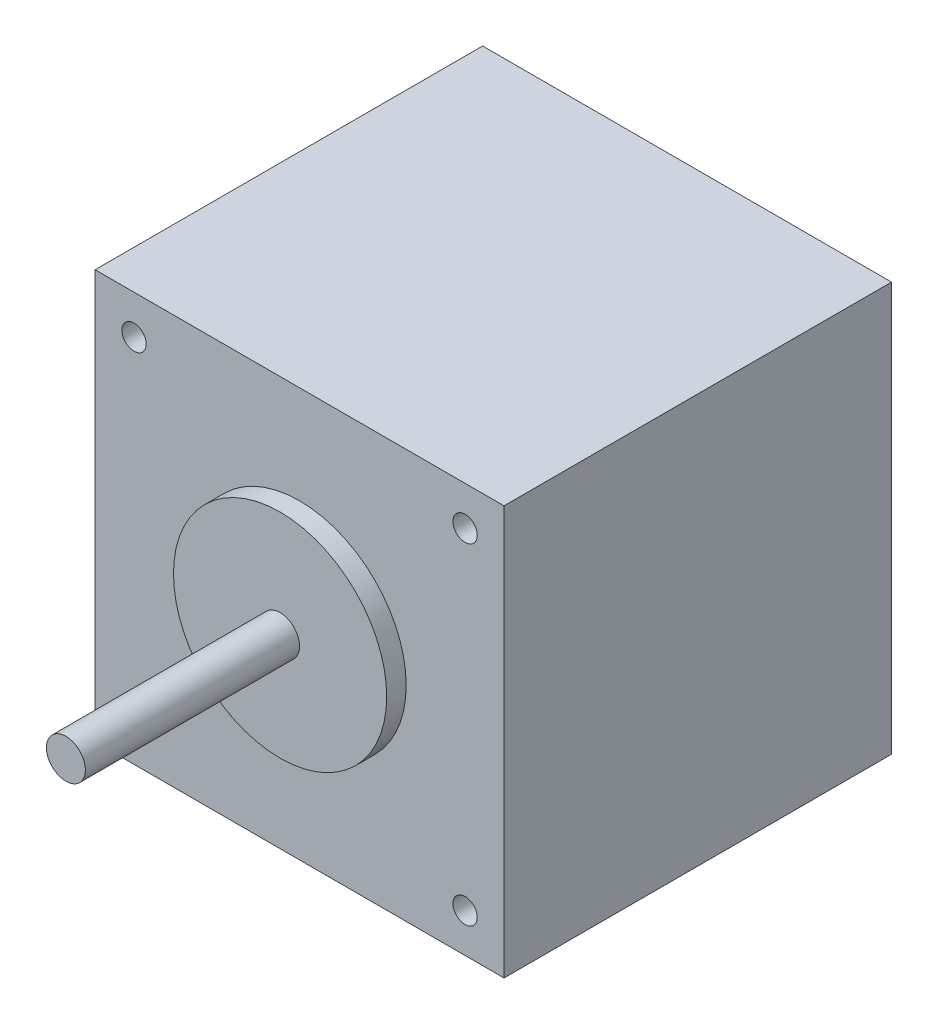
ISO-10303-21;
HEADER;
FILE_DESCRIPTION(('STEP AP214'),'2;1');
FILE_NAME('part.step','',(''),(''),'','','');
FILE_SCHEMA(('AUTOMOTIVE_DESIGN { 1 0 10303 214 1 1 1 1 }'));
ENDSEC;
DATA;
#1=APPLICATION_CONTEXT('core data for automotive mechanical design processes');
#2=APPLICATION_PROTOCOL_DEFINITION('international standard','automotive_design',2000,#1);
#3=PRODUCT_CONTEXT('',#1,'mechanical');
#4=PRODUCT('Part','Part','',(#3));
#5=PRODUCT_RELATED_PRODUCT_CATEGORY('part','',(#4));
#6=PRODUCT_DEFINITION_FORMATION('','',#4);
#7=PRODUCT_DEFINITION_CONTEXT('part definition',#1,'design');
#8=PRODUCT_DEFINITION('design','',#6,#7);
#9=PRODUCT_DEFINITION_SHAPE('','',#8);
#10=(LENGTH_UNIT() NAMED_UNIT(*) SI_UNIT(.MILLI.,.METRE.));
#11=(NAMED_UNIT(*) PLANE_ANGLE_UNIT() SI_UNIT($,.RADIAN.));
#12=(NAMED_UNIT(*) SI_UNIT($,.STERADIAN.) SOLID_ANGLE_UNIT());
#13=UNCERTAINTY_MEASURE_WITH_UNIT(LENGTH_MEASURE(1.E-05),#10,'distance_accuracy_value','');
#14=(GEOMETRIC_REPRESENTATION_CONTEXT(3) GLOBAL_UNCERTAINTY_ASSIGNED_CONTEXT((#13)) GLOBAL_UNIT_ASSIGNED_CONTEXT((#10,
#11,#12)) REPRESENTATION_CONTEXT('',''));
#15=CARTESIAN_POINT('',(0.,0.,0.));
#16=DIRECTION('',(0.,0.,1.));
#17=DIRECTION('',(1.,0.,0.));
#18=AXIS2_PLACEMENT_3D('',#15,#16,#17);
#19=CARTESIAN_POINT('',(21.,-21.,39.8));
#20=DIRECTION('',(-1.,0.,0.));
#21=DIRECTION('',(0.,0.,1.));
#22=AXIS2_PLACEMENT_3D('',#19,#20,#21);
#23=PLANE('',#22);
#24=DIRECTION('',(0.,1.,0.));
#25=VECTOR('',#24,1.);
#26=CARTESIAN_POINT('',(21.,-21.,0.));
#27=LINE('',#26,#25);
#28=CARTESIAN_POINT('',(21.,-21.,0.));
#29=VERTEX_POINT('',#28);
#30=CARTESIAN_POINT('',(21.,21.,0.));
#31=VERTEX_POINT('',#30);
#32=EDGE_CURVE('E103',#29,#31,#27,.T.);
#33=ORIENTED_EDGE('',*,*,#32,.T.);
#34=DIRECTION('',(0.,0.,-1.));
#35=VECTOR('',#34,1.);
#36=CARTESIAN_POINT('',(21.,21.,39.8));
#37=LINE('',#36,#35);
#38=CARTESIAN_POINT('',(21.,21.,39.8));
#39=VERTEX_POINT('',#38);
#40=EDGE_CURVE('E39',#39,#31,#37,.T.);
#41=ORIENTED_EDGE('',*,*,#40,.F.);
#42=DIRECTION('',(0.,1.,0.));
#43=VECTOR('',#42,1.);
#44=CARTESIAN_POINT('',(21.,-21.,39.8));
#45=LINE('',#44,#43);
#46=CARTESIAN_POINT('',(21.,-21.,39.8));
#47=VERTEX_POINT('',#46);
#48=EDGE_CURVE('E90',#47,#39,#45,.T.);
#49=ORIENTED_EDGE('',*,*,#48,.F.);
#50=DIRECTION('',(0.,0.,-1.));
#51=VECTOR('',#50,1.);
#52=CARTESIAN_POINT('',(21.,-21.,39.8));
#53=LINE('',#52,#51);
#54=EDGE_CURVE('E99',#47,#29,#53,.T.);
#55=ORIENTED_EDGE('',*,*,#54,.T.);
#56=EDGE_LOOP('',(#33,#41,#49,#55));
#57=FACE_BOUND('',#56,.T.);
#58=ADVANCED_FACE('F36',(#57),#23,.F.);
#59=CARTESIAN_POINT('',(-21.,21.,39.8));
#60=DIRECTION('',(0.,-1.,0.));
#61=DIRECTION('',(0.,0.,-1.));
#62=AXIS2_PLACEMENT_3D('',#59,#60,#61);
#63=PLANE('',#62);
#64=DIRECTION('',(-1.,0.,0.));
#65=VECTOR('',#64,1.);
#66=CARTESIAN_POINT('',(-21.,21.,0.));
#67=LINE('',#66,#65);
#68=CARTESIAN_POINT('',(-21.,21.,0.));
#69=VERTEX_POINT('',#68);
#70=EDGE_CURVE('E95',#31,#69,#67,.T.);
#71=ORIENTED_EDGE('',*,*,#70,.T.);
#72=DIRECTION('',(0.,0.,-1.));
#73=VECTOR('',#72,1.);
#74=CARTESIAN_POINT('',(-21.,21.,39.8));
#75=LINE('',#74,#73);
#76=CARTESIAN_POINT('',(-21.,21.,39.8));
#77=VERTEX_POINT('',#76);
#78=EDGE_CURVE('E93',#77,#69,#75,.T.);
#79=ORIENTED_EDGE('',*,*,#78,.F.);
#80=DIRECTION('',(-1.,0.,0.));
#81=VECTOR('',#80,1.);
#82=CARTESIAN_POINT('',(-21.,21.,39.8));
#83=LINE('',#82,#81);
#84=EDGE_CURVE('E85',#39,#77,#83,.T.);
#85=ORIENTED_EDGE('',*,*,#84,.F.);
#86=ORIENTED_EDGE('',*,*,#40,.T.);
#87=EDGE_LOOP('',(#71,#79,#85,#86));
#88=FACE_BOUND('',#87,.T.);
#89=ADVANCED_FACE('F94',(#88),#63,.F.);
#90=CARTESIAN_POINT('',(-21.,-21.,39.8));
#91=DIRECTION('',(1.,0.,0.));
#92=DIRECTION('',(0.,0.,-1.));
#93=AXIS2_PLACEMENT_3D('',#90,#91,#92);
#94=PLANE('',#93);
#95=DIRECTION('',(0.,-1.,0.));
#96=VECTOR('',#95,1.);
#97=CARTESIAN_POINT('',(-21.,-21.,0.));
#98=LINE('',#97,#96);
#99=CARTESIAN_POINT('',(-21.,-21.,0.));
#100=VERTEX_POINT('',#99);
#101=EDGE_CURVE('E71',#69,#100,#98,.T.);
#102=ORIENTED_EDGE('',*,*,#101,.T.);
#103=DIRECTION('',(0.,0.,-1.));
#104=VECTOR('',#103,1.);
#105=CARTESIAN_POINT('',(-21.,-21.,39.8));
#106=LINE('',#105,#104);
#107=CARTESIAN_POINT('',(-21.,-21.,39.8));
#108=VERTEX_POINT('',#107);
#109=EDGE_CURVE('E96',#108,#100,#106,.T.);
#110=ORIENTED_EDGE('',*,*,#109,.F.);
#111=DIRECTION('',(0.,-1.,0.));
#112=VECTOR('',#111,1.);
#113=CARTESIAN_POINT('',(-21.,-21.,39.8));
#114=LINE('',#113,#112);
#115=EDGE_CURVE('E88',#77,#108,#114,.T.);
#116=ORIENTED_EDGE('',*,*,#115,.F.);
#117=ORIENTED_EDGE('',*,*,#78,.T.);
#118=EDGE_LOOP('',(#102,#110,#116,#117));
#119=FACE_BOUND('',#118,.T.);
#120=ADVANCED_FACE('F97',(#119),#94,.F.);
#121=CARTESIAN_POINT('',(-21.,-21.,39.8));
#122=DIRECTION('',(0.,1.,0.));
#123=DIRECTION('',(0.,0.,1.));
#124=AXIS2_PLACEMENT_3D('',#121,#122,#123);
#125=PLANE('',#124);
#126=DIRECTION('',(1.,0.,0.));
#127=VECTOR('',#126,1.);
#128=CARTESIAN_POINT('',(-21.,-21.,0.));
#129=LINE('',#128,#127);
#130=EDGE_CURVE('E77',#100,#29,#129,.T.);
#131=ORIENTED_EDGE('',*,*,#130,.T.);
#132=ORIENTED_EDGE('',*,*,#54,.F.);
#133=DIRECTION('',(1.,0.,0.));
#134=VECTOR('',#133,1.);
#135=CARTESIAN_POINT('',(-21.,-21.,39.8));
#136=LINE('',#135,#134);
#137=EDGE_CURVE('E54',#108,#47,#136,.T.);
#138=ORIENTED_EDGE('',*,*,#137,.F.);
#139=ORIENTED_EDGE('',*,*,#109,.T.);
#140=EDGE_LOOP('',(#131,#132,#138,#139));
#141=FACE_BOUND('',#140,.T.);
#142=ADVANCED_FACE('F111',(#141),#125,.F.);
#143=CARTESIAN_POINT('',(0.,0.,39.8));
#144=DIRECTION('',(0.,0.,-1.));
#145=DIRECTION('',(-1.,0.,0.));
#146=AXIS2_PLACEMENT_3D('',#143,#144,#145);
#147=PLANE('',#146);
#148=CARTESIAN_POINT('',(-17.,-17.,39.8));
#149=DIRECTION('',(0.,0.,1.));
#150=DIRECTION('',(1.,0.,0.));
#151=AXIS2_PLACEMENT_3D('',#148,#149,#150);
#152=CIRCLE('',#151,1.25);
#153=CARTESIAN_POINT('',(-15.75,-17.,39.8));
#154=VERTEX_POINT('',#153);
#155=EDGE_CURVE('E128',#154,#154,#152,.T.);
#156=ORIENTED_EDGE('',*,*,#155,.F.);
#157=EDGE_LOOP('',(#156));
#158=FACE_BOUND('',#157,.T.);
#159=CARTESIAN_POINT('',(17.,-17.,39.8));
#160=DIRECTION('',(0.,0.,1.));
#161=DIRECTION('',(1.,0.,0.));
#162=AXIS2_PLACEMENT_3D('',#159,#160,#161);
#163=CIRCLE('',#162,1.25);
#164=CARTESIAN_POINT('',(18.25,-17.,39.8));
#165=VERTEX_POINT('',#164);
#166=EDGE_CURVE('E135',#165,#165,#163,.T.);
#167=ORIENTED_EDGE('',*,*,#166,.F.);
#168=EDGE_LOOP('',(#167));
#169=FACE_BOUND('',#168,.T.);
#170=CARTESIAN_POINT('',(17.,17.,39.8));
#171=DIRECTION('',(0.,0.,1.));
#172=DIRECTION('',(1.,0.,0.));
#173=AXIS2_PLACEMENT_3D('',#170,#171,#172);
#174=CIRCLE('',#173,1.25);
#175=CARTESIAN_POINT('',(18.25,17.,39.8));
#176=VERTEX_POINT('',#175);
#177=EDGE_CURVE('E141',#176,#176,#174,.T.);
#178=ORIENTED_EDGE('',*,*,#177,.F.);
#179=EDGE_LOOP('',(#178));
#180=FACE_BOUND('',#179,.T.);
#181=CARTESIAN_POINT('',(-17.,17.,39.8));
#182=DIRECTION('',(0.,0.,1.));
#183=DIRECTION('',(1.,0.,0.));
#184=AXIS2_PLACEMENT_3D('',#181,#182,#183);
#185=CIRCLE('',#184,1.25);
#186=CARTESIAN_POINT('',(-15.75,17.,39.8));
#187=VERTEX_POINT('',#186);
#188=EDGE_CURVE('E122',#187,#187,#185,.T.);
#189=ORIENTED_EDGE('',*,*,#188,.F.);
#190=EDGE_LOOP('',(#189));
#191=FACE_BOUND('',#190,.T.);
#192=CARTESIAN_POINT('',(0.,0.,39.8));
#193=DIRECTION('',(0.,0.,1.));
#194=DIRECTION('',(1.,0.,0.));
#195=AXIS2_PLACEMENT_3D('',#192,#193,#194);
#196=CIRCLE('',#195,10.95);
#197=CARTESIAN_POINT('',(10.95,0.,39.8));
#198=VERTEX_POINT('',#197);
#199=EDGE_CURVE('E45',#198,#198,#196,.T.);
#200=ORIENTED_EDGE('',*,*,#199,.F.);
#201=EDGE_LOOP('',(#200));
#202=FACE_BOUND('',#201,.T.);
#203=ORIENTED_EDGE('',*,*,#48,.T.);
#204=ORIENTED_EDGE('',*,*,#84,.T.);
#205=ORIENTED_EDGE('',*,*,#115,.T.);
#206=ORIENTED_EDGE('',*,*,#137,.T.);
#207=EDGE_LOOP('',(#203,#204,#205,#206));
#208=FACE_BOUND('',#207,.T.);
#209=ADVANCED_FACE('F86',(#158,#169,#180,#191,#202,#208),#147,.F.);
#210=CARTESIAN_POINT('',(0.,0.,0.));
#211=DIRECTION('',(0.,0.,-1.));
#212=DIRECTION('',(-1.,0.,0.));
#213=AXIS2_PLACEMENT_3D('',#210,#211,#212);
#214=PLANE('',#213);
#215=ORIENTED_EDGE('',*,*,#32,.F.);
#216=ORIENTED_EDGE('',*,*,#130,.F.);
#217=ORIENTED_EDGE('',*,*,#101,.F.);
#218=ORIENTED_EDGE('',*,*,#70,.F.);
#219=EDGE_LOOP('',(#215,#216,#217,#218));
#220=FACE_BOUND('',#219,.T.);
#221=ADVANCED_FACE('F114',(#220),#214,.T.);
#222=CARTESIAN_POINT('',(0.,0.,41.8));
#223=DIRECTION('',(0.,0.,-1.));
#224=DIRECTION('',(-1.,0.,0.));
#225=AXIS2_PLACEMENT_3D('',#222,#223,#224);
#226=CYLINDRICAL_SURFACE('',#225,10.95);
#227=CARTESIAN_POINT('',(0.,0.,41.8));
#228=DIRECTION('',(0.,0.,1.));
#229=DIRECTION('',(1.,0.,0.));
#230=AXIS2_PLACEMENT_3D('',#227,#228,#229);
#231=CIRCLE('',#230,10.95);
#232=CARTESIAN_POINT('',(10.95,0.,41.8));
#233=VERTEX_POINT('',#232);
#234=EDGE_CURVE('E106',#233,#233,#231,.T.);
#235=ORIENTED_EDGE('',*,*,#234,.F.);
#236=EDGE_LOOP('',(#235));
#237=FACE_BOUND('',#236,.T.);
#238=ORIENTED_EDGE('',*,*,#199,.T.);
#239=EDGE_LOOP('',(#238));
#240=FACE_BOUND('',#239,.T.);
#241=ADVANCED_FACE('F162',(#237,#240),#226,.T.);
#242=CARTESIAN_POINT('',(0.,0.,41.8));
#243=DIRECTION('',(0.,0.,1.));
#244=DIRECTION('',(1.,0.,0.));
#245=AXIS2_PLACEMENT_3D('',#242,#243,#244);
#246=PLANE('',#245);
#247=CARTESIAN_POINT('',(0.,0.,41.8));
#248=DIRECTION('',(0.,0.,1.));
#249=DIRECTION('',(1.,0.,0.));
#250=AXIS2_PLACEMENT_3D('',#247,#248,#249);
#251=CIRCLE('',#250,2.);
#252=CARTESIAN_POINT('',(2.,0.,41.8));
#253=VERTEX_POINT('',#252);
#254=EDGE_CURVE('E11',#253,#253,#251,.T.);
#255=ORIENTED_EDGE('',*,*,#254,.F.);
#256=EDGE_LOOP('',(#255));
#257=FACE_BOUND('',#256,.T.);
#258=ORIENTED_EDGE('',*,*,#234,.T.);
#259=EDGE_LOOP('',(#258));
#260=FACE_BOUND('',#259,.T.);
#261=ADVANCED_FACE('F158',(#257,#260),#246,.T.);
#262=CARTESIAN_POINT('',(-17.,17.,29.8));
#263=DIRECTION('',(0.,0.,1.));
#264=DIRECTION('',(1.,0.,0.));
#265=AXIS2_PLACEMENT_3D('',#262,#263,#264);
#266=CYLINDRICAL_SURFACE('',#265,1.25);
#267=CARTESIAN_POINT('',(-17.,17.,29.8));
#268=DIRECTION('',(0.,0.,1.));
#269=DIRECTION('',(1.,0.,0.));
#270=AXIS2_PLACEMENT_3D('',#267,#268,#269);
#271=CIRCLE('',#270,1.25);
#272=CARTESIAN_POINT('',(-15.75,17.,29.8));
#273=VERTEX_POINT('',#272);
#274=EDGE_CURVE('E121',#273,#273,#271,.T.);
#275=ORIENTED_EDGE('',*,*,#274,.F.);
#276=EDGE_LOOP('',(#275));
#277=FACE_BOUND('',#276,.T.);
#278=ORIENTED_EDGE('',*,*,#188,.T.);
#279=EDGE_LOOP('',(#278));
#280=FACE_BOUND('',#279,.T.);
#281=ADVANCED_FACE('F161',(#277,#280),#266,.F.);
#282=CARTESIAN_POINT('',(-17.,17.,29.8));
#283=DIRECTION('',(0.,0.,1.));
#284=DIRECTION('',(1.,0.,0.));
#285=AXIS2_PLACEMENT_3D('',#282,#283,#284);
#286=PLANE('',#285);
#287=ORIENTED_EDGE('',*,*,#274,.T.);
#288=EDGE_LOOP('',(#287));
#289=FACE_BOUND('',#288,.T.);
#290=ADVANCED_FACE('F222',(#289),#286,.T.);
#291=CARTESIAN_POINT('',(17.,17.,29.8));
#292=DIRECTION('',(0.,0.,1.));
#293=DIRECTION('',(1.,0.,0.));
#294=AXIS2_PLACEMENT_3D('',#291,#292,#293);
#295=CYLINDRICAL_SURFACE('',#294,1.25);
#296=CARTESIAN_POINT('',(17.,17.,29.8));
#297=DIRECTION('',(0.,0.,1.));
#298=DIRECTION('',(1.,0.,0.));
#299=AXIS2_PLACEMENT_3D('',#296,#297,#298);
#300=CIRCLE('',#299,1.25);
#301=CARTESIAN_POINT('',(18.25,17.,29.8));
#302=VERTEX_POINT('',#301);
#303=EDGE_CURVE('E125',#302,#302,#300,.T.);
#304=ORIENTED_EDGE('',*,*,#303,.F.);
#305=EDGE_LOOP('',(#304));
#306=FACE_BOUND('',#305,.T.);
#307=ORIENTED_EDGE('',*,*,#177,.T.);
#308=EDGE_LOOP('',(#307));
#309=FACE_BOUND('',#308,.T.);
#310=ADVANCED_FACE('F232',(#306,#309),#295,.F.);
#311=CARTESIAN_POINT('',(17.,17.,29.8));
#312=DIRECTION('',(0.,0.,1.));
#313=DIRECTION('',(1.,0.,0.));
#314=AXIS2_PLACEMENT_3D('',#311,#312,#313);
#315=PLANE('',#314);
#316=ORIENTED_EDGE('',*,*,#303,.T.);
#317=EDGE_LOOP('',(#316));
#318=FACE_BOUND('',#317,.T.);
#319=ADVANCED_FACE('F242',(#318),#315,.T.);
#320=CARTESIAN_POINT('',(17.,-17.,29.8));
#321=DIRECTION('',(0.,0.,1.));
#322=DIRECTION('',(1.,0.,0.));
#323=AXIS2_PLACEMENT_3D('',#320,#321,#322);
#324=CYLINDRICAL_SURFACE('',#323,1.25);
#325=CARTESIAN_POINT('',(17.,-17.,29.8));
#326=DIRECTION('',(0.,0.,1.));
#327=DIRECTION('',(1.,0.,0.));
#328=AXIS2_PLACEMENT_3D('',#325,#326,#327);
#329=CIRCLE('',#328,1.25);
#330=CARTESIAN_POINT('',(18.25,-17.,29.8));
#331=VERTEX_POINT('',#330);
#332=EDGE_CURVE('E138',#331,#331,#329,.T.);
#333=ORIENTED_EDGE('',*,*,#332,.F.);
#334=EDGE_LOOP('',(#333));
#335=FACE_BOUND('',#334,.T.);
#336=ORIENTED_EDGE('',*,*,#166,.T.);
#337=EDGE_LOOP('',(#336));
#338=FACE_BOUND('',#337,.T.);
#339=ADVANCED_FACE('F252',(#335,#338),#324,.F.);
#340=CARTESIAN_POINT('',(17.,-17.,29.8));
#341=DIRECTION('',(0.,0.,1.));
#342=DIRECTION('',(1.,0.,0.));
#343=AXIS2_PLACEMENT_3D('',#340,#341,#342);
#344=PLANE('',#343);
#345=ORIENTED_EDGE('',*,*,#332,.T.);
#346=EDGE_LOOP('',(#345));
#347=FACE_BOUND('',#346,.T.);
#348=ADVANCED_FACE('F262',(#347),#344,.T.);
#349=CARTESIAN_POINT('',(-17.,-17.,29.8));
#350=DIRECTION('',(0.,0.,1.));
#351=DIRECTION('',(1.,0.,0.));
#352=AXIS2_PLACEMENT_3D('',#349,#350,#351);
#353=CYLINDRICAL_SURFACE('',#352,1.25);
#354=CARTESIAN_POINT('',(-17.,-17.,29.8));
#355=DIRECTION('',(0.,0.,1.));
#356=DIRECTION('',(1.,0.,0.));
#357=AXIS2_PLACEMENT_3D('',#354,#355,#356);
#358=CIRCLE('',#357,1.25);
#359=CARTESIAN_POINT('',(-15.75,-17.,29.8));
#360=VERTEX_POINT('',#359);
#361=EDGE_CURVE('E131',#360,#360,#358,.T.);
#362=ORIENTED_EDGE('',*,*,#361,.F.);
#363=EDGE_LOOP('',(#362));
#364=FACE_BOUND('',#363,.T.);
#365=ORIENTED_EDGE('',*,*,#155,.T.);
#366=EDGE_LOOP('',(#365));
#367=FACE_BOUND('',#366,.T.);
#368=ADVANCED_FACE('F272',(#364,#367),#353,.F.);
#369=CARTESIAN_POINT('',(-17.,-17.,29.8));
#370=DIRECTION('',(0.,0.,1.));
#371=DIRECTION('',(1.,0.,0.));
#372=AXIS2_PLACEMENT_3D('',#369,#370,#371);
#373=PLANE('',#372);
#374=ORIENTED_EDGE('',*,*,#361,.T.);
#375=EDGE_LOOP('',(#374));
#376=FACE_BOUND('',#375,.T.);
#377=ADVANCED_FACE('F154',(#376),#373,.T.);
#378=CARTESIAN_POINT('',(0.,0.,63.8));
#379=DIRECTION('',(0.,0.,-1.));
#380=DIRECTION('',(-1.,0.,0.));
#381=AXIS2_PLACEMENT_3D('',#378,#379,#380);
#382=CYLINDRICAL_SURFACE('',#381,2.);
#383=CARTESIAN_POINT('',(0.,0.,63.8));
#384=DIRECTION('',(0.,0.,1.));
#385=DIRECTION('',(1.,0.,0.));
#386=AXIS2_PLACEMENT_3D('',#383,#384,#385);
#387=CIRCLE('',#386,2.);
#388=CARTESIAN_POINT('',(2.,0.,63.8));
#389=VERTEX_POINT('',#388);
#390=EDGE_CURVE('E132',#389,#389,#387,.T.);
#391=ORIENTED_EDGE('',*,*,#390,.F.);
#392=EDGE_LOOP('',(#391));
#393=FACE_BOUND('',#392,.T.);
#394=ORIENTED_EDGE('',*,*,#254,.T.);
#395=EDGE_LOOP('',(#394));
#396=FACE_BOUND('',#395,.T.);
#397=ADVANCED_FACE('F151',(#393,#396),#382,.T.);
#398=CARTESIAN_POINT('',(0.,0.,63.8));
#399=DIRECTION('',(0.,0.,1.));
#400=DIRECTION('',(1.,0.,0.));
#401=AXIS2_PLACEMENT_3D('',#398,#399,#400);
#402=PLANE('',#401);
#403=ORIENTED_EDGE('',*,*,#390,.T.);
#404=EDGE_LOOP('',(#403));
#405=FACE_BOUND('',#404,.T.);
#406=ADVANCED_FACE('F149',(#405),#402,.T.);
#407=CLOSED_SHELL('',(#58,#89,#120,#142,#209,#221,#241,#261,#281,#290,#310,#319,#339,#348,#368,
#377,#397,#406));
#408=MANIFOLD_SOLID_BREP('B2',#407);
#409=ADVANCED_BREP_SHAPE_REPRESENTATION('',(#18,#408),#14);
#410=SHAPE_DEFINITION_REPRESENTATION(#9,#409);
ENDSEC;
END-ISO-10303-21;
